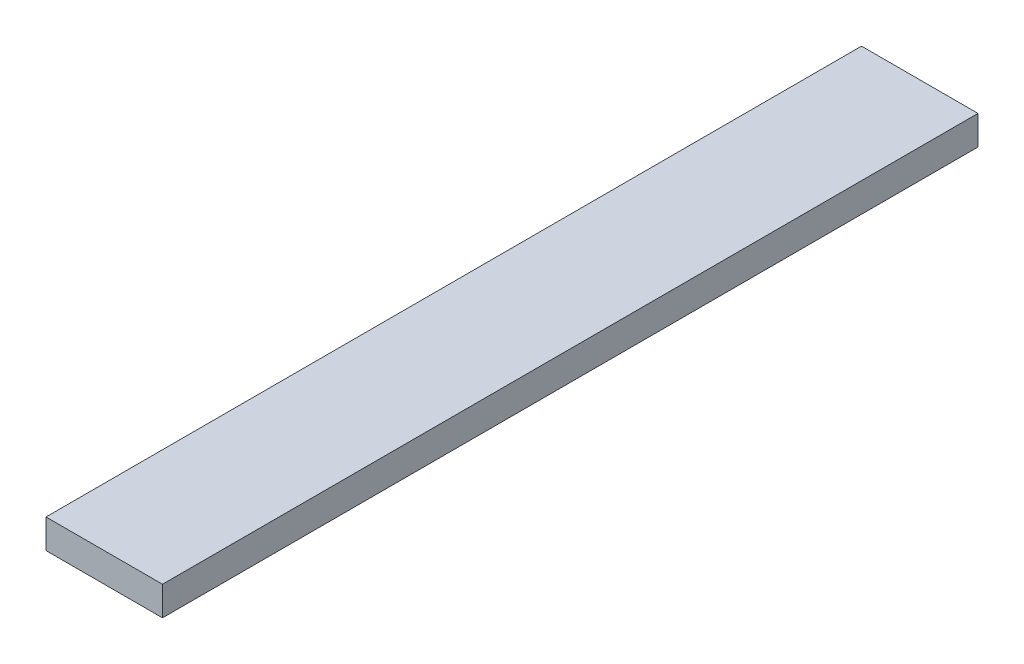
ISO-10303-21;
HEADER;
FILE_DESCRIPTION(('STEP AP214'),'2;1');
FILE_NAME('part.step','',(''),(''),'','','');
FILE_SCHEMA(('AUTOMOTIVE_DESIGN { 1 0 10303 214 1 1 1 1 }'));
ENDSEC;
DATA;
#1=APPLICATION_CONTEXT('core data for automotive mechanical design processes');
#2=APPLICATION_PROTOCOL_DEFINITION('international standard','automotive_design',2000,#1);
#3=PRODUCT_CONTEXT('',#1,'mechanical');
#4=PRODUCT('Part','Part','',(#3));
#5=PRODUCT_RELATED_PRODUCT_CATEGORY('part','',(#4));
#6=PRODUCT_DEFINITION_FORMATION('','',#4);
#7=PRODUCT_DEFINITION_CONTEXT('part definition',#1,'design');
#8=PRODUCT_DEFINITION('design','',#6,#7);
#9=PRODUCT_DEFINITION_SHAPE('','',#8);
#10=(LENGTH_UNIT() NAMED_UNIT(*) SI_UNIT(.MILLI.,.METRE.));
#11=(NAMED_UNIT(*) PLANE_ANGLE_UNIT() SI_UNIT($,.RADIAN.));
#12=(NAMED_UNIT(*) SI_UNIT($,.STERADIAN.) SOLID_ANGLE_UNIT());
#13=UNCERTAINTY_MEASURE_WITH_UNIT(LENGTH_MEASURE(1.E-05),#10,'distance_accuracy_value','');
#14=(GEOMETRIC_REPRESENTATION_CONTEXT(3) GLOBAL_UNCERTAINTY_ASSIGNED_CONTEXT((#13)) GLOBAL_UNIT_ASSIGNED_CONTEXT((#10,
#11,#12)) REPRESENTATION_CONTEXT('',''));
#15=CARTESIAN_POINT('',(0.,0.,0.));
#16=DIRECTION('',(0.,0.,1.));
#17=DIRECTION('',(1.,0.,0.));
#18=AXIS2_PLACEMENT_3D('',#15,#16,#17);
#19=CARTESIAN_POINT('',(12.7,6.35,88.9));
#20=DIRECTION('',(-1.,0.,0.));
#21=DIRECTION('',(0.,0.,1.));
#22=AXIS2_PLACEMENT_3D('',#19,#20,#21);
#23=PLANE('',#22);
#24=DIRECTION('',(0.,0.,-1.));
#25=VECTOR('',#24,1.);
#26=CARTESIAN_POINT('',(12.7,0.,88.9));
#27=LINE('',#26,#25);
#28=CARTESIAN_POINT('',(12.7,0.,88.9));
#29=VERTEX_POINT('',#28);
#30=CARTESIAN_POINT('',(12.7,0.,-88.9));
#31=VERTEX_POINT('',#30);
#32=EDGE_CURVE('E96',#29,#31,#27,.T.);
#33=ORIENTED_EDGE('',*,*,#32,.T.);
#34=DIRECTION('',(0.,-1.,0.));
#35=VECTOR('',#34,1.);
#36=CARTESIAN_POINT('',(12.7,6.35,-88.9));
#37=LINE('',#36,#35);
#38=CARTESIAN_POINT('',(12.7,6.35,-88.9));
#39=VERTEX_POINT('',#38);
#40=EDGE_CURVE('E11',#39,#31,#37,.T.);
#41=ORIENTED_EDGE('',*,*,#40,.F.);
#42=DIRECTION('',(0.,0.,-1.));
#43=VECTOR('',#42,1.);
#44=CARTESIAN_POINT('',(12.7,6.35,88.9));
#45=LINE('',#44,#43);
#46=CARTESIAN_POINT('',(12.7,6.35,88.9));
#47=VERTEX_POINT('',#46);
#48=EDGE_CURVE('E84',#47,#39,#45,.T.);
#49=ORIENTED_EDGE('',*,*,#48,.F.);
#50=DIRECTION('',(0.,-1.,0.));
#51=VECTOR('',#50,1.);
#52=CARTESIAN_POINT('',(12.7,6.35,88.9));
#53=LINE('',#52,#51);
#54=EDGE_CURVE('E92',#47,#29,#53,.T.);
#55=ORIENTED_EDGE('',*,*,#54,.T.);
#56=EDGE_LOOP('',(#33,#41,#49,#55));
#57=FACE_BOUND('',#56,.T.);
#58=ADVANCED_FACE('F33',(#57),#23,.F.);
#59=CARTESIAN_POINT('',(-12.7,6.35,-88.9));
#60=DIRECTION('',(0.,0.,1.));
#61=DIRECTION('',(1.,0.,0.));
#62=AXIS2_PLACEMENT_3D('',#59,#60,#61);
#63=PLANE('',#62);
#64=DIRECTION('',(-1.,0.,0.));
#65=VECTOR('',#64,1.);
#66=CARTESIAN_POINT('',(-12.7,0.,-88.9));
#67=LINE('',#66,#65);
#68=CARTESIAN_POINT('',(-12.7,0.,-88.9));
#69=VERTEX_POINT('',#68);
#70=EDGE_CURVE('E88',#31,#69,#67,.T.);
#71=ORIENTED_EDGE('',*,*,#70,.T.);
#72=DIRECTION('',(0.,-1.,0.));
#73=VECTOR('',#72,1.);
#74=CARTESIAN_POINT('',(-12.7,6.35,-88.9));
#75=LINE('',#74,#73);
#76=CARTESIAN_POINT('',(-12.7,6.35,-88.9));
#77=VERTEX_POINT('',#76);
#78=EDGE_CURVE('E41',#77,#69,#75,.T.);
#79=ORIENTED_EDGE('',*,*,#78,.F.);
#80=DIRECTION('',(-1.,0.,0.));
#81=VECTOR('',#80,1.);
#82=CARTESIAN_POINT('',(-12.7,6.35,-88.9));
#83=LINE('',#82,#81);
#84=EDGE_CURVE('E79',#39,#77,#83,.T.);
#85=ORIENTED_EDGE('',*,*,#84,.F.);
#86=ORIENTED_EDGE('',*,*,#40,.T.);
#87=EDGE_LOOP('',(#71,#79,#85,#86));
#88=FACE_BOUND('',#87,.T.);
#89=ADVANCED_FACE('F87',(#88),#63,.F.);
#90=CARTESIAN_POINT('',(-12.7,6.35,88.9));
#91=DIRECTION('',(1.,0.,0.));
#92=DIRECTION('',(0.,0.,-1.));
#93=AXIS2_PLACEMENT_3D('',#90,#91,#92);
#94=PLANE('',#93);
#95=DIRECTION('',(0.,0.,1.));
#96=VECTOR('',#95,1.);
#97=CARTESIAN_POINT('',(-12.7,0.,88.9));
#98=LINE('',#97,#96);
#99=CARTESIAN_POINT('',(-12.7,0.,88.9));
#100=VERTEX_POINT('',#99);
#101=EDGE_CURVE('E66',#69,#100,#98,.T.);
#102=ORIENTED_EDGE('',*,*,#101,.T.);
#103=DIRECTION('',(0.,-1.,0.));
#104=VECTOR('',#103,1.);
#105=CARTESIAN_POINT('',(-12.7,6.35,88.9));
#106=LINE('',#105,#104);
#107=CARTESIAN_POINT('',(-12.7,6.35,88.9));
#108=VERTEX_POINT('',#107);
#109=EDGE_CURVE('E89',#108,#100,#106,.T.);
#110=ORIENTED_EDGE('',*,*,#109,.F.);
#111=DIRECTION('',(0.,0.,1.));
#112=VECTOR('',#111,1.);
#113=CARTESIAN_POINT('',(-12.7,6.35,88.9));
#114=LINE('',#113,#112);
#115=EDGE_CURVE('E82',#77,#108,#114,.T.);
#116=ORIENTED_EDGE('',*,*,#115,.F.);
#117=ORIENTED_EDGE('',*,*,#78,.T.);
#118=EDGE_LOOP('',(#102,#110,#116,#117));
#119=FACE_BOUND('',#118,.T.);
#120=ADVANCED_FACE('F90',(#119),#94,.F.);
#121=CARTESIAN_POINT('',(-12.7,6.35,88.9));
#122=DIRECTION('',(0.,0.,-1.));
#123=DIRECTION('',(-1.,0.,0.));
#124=AXIS2_PLACEMENT_3D('',#121,#122,#123);
#125=PLANE('',#124);
#126=DIRECTION('',(1.,0.,0.));
#127=VECTOR('',#126,1.);
#128=CARTESIAN_POINT('',(-12.7,0.,88.9));
#129=LINE('',#128,#127);
#130=EDGE_CURVE('E72',#100,#29,#129,.T.);
#131=ORIENTED_EDGE('',*,*,#130,.T.);
#132=ORIENTED_EDGE('',*,*,#54,.F.);
#133=DIRECTION('',(1.,0.,0.));
#134=VECTOR('',#133,1.);
#135=CARTESIAN_POINT('',(-12.7,6.35,88.9));
#136=LINE('',#135,#134);
#137=EDGE_CURVE('E49',#108,#47,#136,.T.);
#138=ORIENTED_EDGE('',*,*,#137,.F.);
#139=ORIENTED_EDGE('',*,*,#109,.T.);
#140=EDGE_LOOP('',(#131,#132,#138,#139));
#141=FACE_BOUND('',#140,.T.);
#142=ADVANCED_FACE('F103',(#141),#125,.F.);
#143=CARTESIAN_POINT('',(0.,6.35,0.));
#144=DIRECTION('',(0.,-1.,0.));
#145=DIRECTION('',(0.,0.,-1.));
#146=AXIS2_PLACEMENT_3D('',#143,#144,#145);
#147=PLANE('',#146);
#148=ORIENTED_EDGE('',*,*,#48,.T.);
#149=ORIENTED_EDGE('',*,*,#84,.T.);
#150=ORIENTED_EDGE('',*,*,#115,.T.);
#151=ORIENTED_EDGE('',*,*,#137,.T.);
#152=EDGE_LOOP('',(#148,#149,#150,#151));
#153=FACE_BOUND('',#152,.T.);
#154=ADVANCED_FACE('F80',(#153),#147,.F.);
#155=CARTESIAN_POINT('',(0.,0.,0.));
#156=DIRECTION('',(0.,-1.,0.));
#157=DIRECTION('',(0.,0.,-1.));
#158=AXIS2_PLACEMENT_3D('',#155,#156,#157);
#159=PLANE('',#158);
#160=ORIENTED_EDGE('',*,*,#32,.F.);
#161=ORIENTED_EDGE('',*,*,#130,.F.);
#162=ORIENTED_EDGE('',*,*,#101,.F.);
#163=ORIENTED_EDGE('',*,*,#70,.F.);
#164=EDGE_LOOP('',(#160,#161,#162,#163));
#165=FACE_BOUND('',#164,.T.);
#166=ADVANCED_FACE('F106',(#165),#159,.T.);
#167=CLOSED_SHELL('',(#58,#89,#120,#142,#154,#166));
#168=MANIFOLD_SOLID_BREP('B2',#167);
#169=ADVANCED_BREP_SHAPE_REPRESENTATION('',(#18,#168),#14);
#170=SHAPE_DEFINITION_REPRESENTATION(#9,#169);
ENDSEC;
END-ISO-10303-21;
